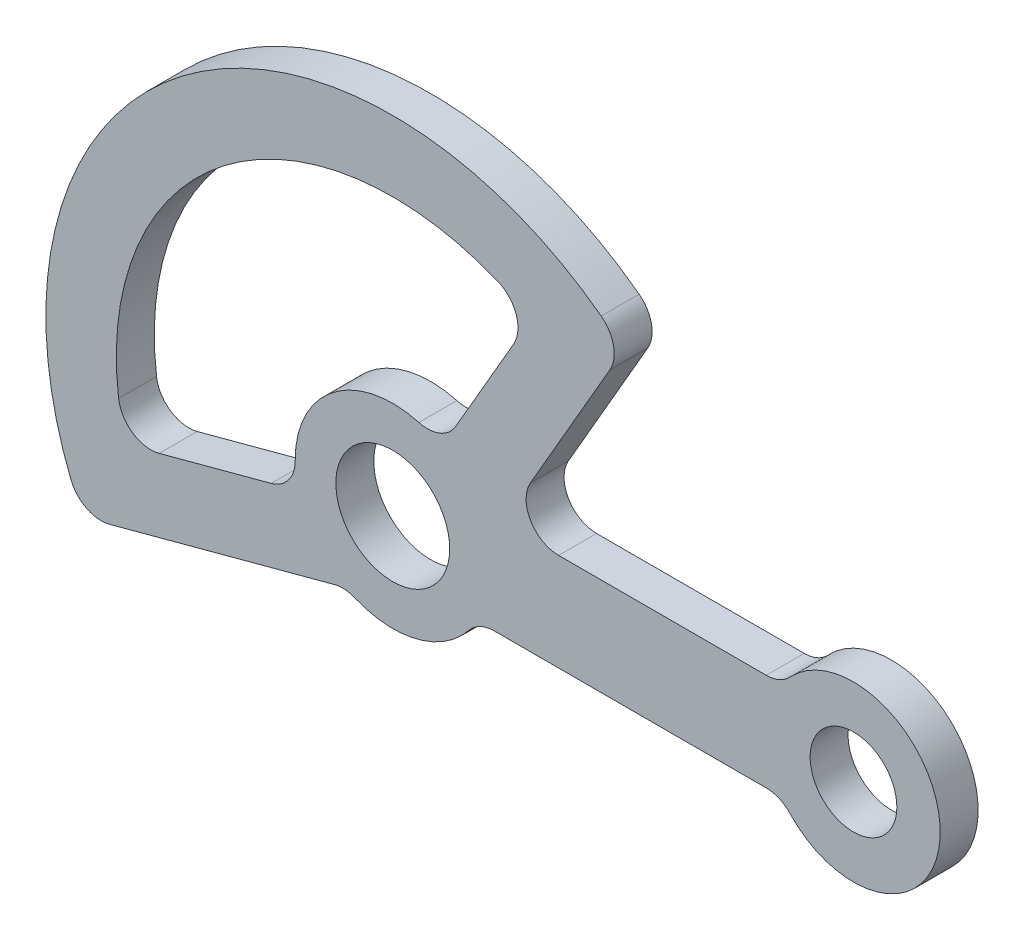
ISO-10303-21;
HEADER;
FILE_DESCRIPTION(('STEP AP214'),'2;1');
FILE_NAME('part.step','',(''),(''),'','','');
FILE_SCHEMA(('AUTOMOTIVE_DESIGN { 1 0 10303 214 1 1 1 1 }'));
ENDSEC;
DATA;
#1=APPLICATION_CONTEXT('core data for automotive mechanical design processes');
#2=APPLICATION_PROTOCOL_DEFINITION('international standard','automotive_design',2000,#1);
#3=PRODUCT_CONTEXT('',#1,'mechanical');
#4=PRODUCT('Part','Part','',(#3));
#5=PRODUCT_RELATED_PRODUCT_CATEGORY('part','',(#4));
#6=PRODUCT_DEFINITION_FORMATION('','',#4);
#7=PRODUCT_DEFINITION_CONTEXT('part definition',#1,'design');
#8=PRODUCT_DEFINITION('design','',#6,#7);
#9=PRODUCT_DEFINITION_SHAPE('','',#8);
#10=(LENGTH_UNIT() NAMED_UNIT(*) SI_UNIT(.MILLI.,.METRE.));
#11=(NAMED_UNIT(*) PLANE_ANGLE_UNIT() SI_UNIT($,.RADIAN.));
#12=(NAMED_UNIT(*) SI_UNIT($,.STERADIAN.) SOLID_ANGLE_UNIT());
#13=UNCERTAINTY_MEASURE_WITH_UNIT(LENGTH_MEASURE(1.E-05),#10,'distance_accuracy_value','');
#14=(GEOMETRIC_REPRESENTATION_CONTEXT(3) GLOBAL_UNCERTAINTY_ASSIGNED_CONTEXT((#13)) GLOBAL_UNIT_ASSIGNED_CONTEXT((#10,
#11,#12)) REPRESENTATION_CONTEXT('',''));
#15=CARTESIAN_POINT('',(0.,0.,0.));
#16=DIRECTION('',(0.,0.,1.));
#17=DIRECTION('',(1.,0.,0.));
#18=AXIS2_PLACEMENT_3D('',#15,#16,#17);
#19=CARTESIAN_POINT('',(0.,0.,7.));
#20=DIRECTION('',(-0.866025403784442,0.499999999999994,0.));
#21=DIRECTION('',(-0.499999999999995,-0.866025403784442,0.));
#22=AXIS2_PLACEMENT_3D('',#19,#20,#21);
#23=PLANE('',#22);
#24=DIRECTION('',(0.499999999999995,0.866025403784442,0.));
#25=VECTOR('',#24,1.);
#26=CARTESIAN_POINT('',(0.,0.,0.));
#27=LINE('',#26,#25);
#28=CARTESIAN_POINT('',(11.6189500386221,20.1246117974982,0.));
#29=VERTEX_POINT('',#28);
#30=CARTESIAN_POINT('',(22.2991031209775,38.6231795687513,0.));
#31=VERTEX_POINT('',#30);
#32=EDGE_CURVE('E275',#29,#31,#27,.T.);
#33=ORIENTED_EDGE('',*,*,#32,.F.);
#34=DIRECTION('',(0.,0.,-1.));
#35=VECTOR('',#34,1.);
#36=CARTESIAN_POINT('',(11.6189500386221,20.1246117974982,7.));
#37=LINE('',#36,#35);
#38=CARTESIAN_POINT('',(11.6189500386221,20.1246117974982,7.));
#39=VERTEX_POINT('',#38);
#40=EDGE_CURVE('E11',#39,#29,#37,.T.);
#41=ORIENTED_EDGE('',*,*,#40,.F.);
#42=DIRECTION('',(0.499999999999995,0.866025403784442,0.));
#43=VECTOR('',#42,1.);
#44=CARTESIAN_POINT('',(0.,0.,7.));
#45=LINE('',#44,#43);
#46=CARTESIAN_POINT('',(22.2991031209775,38.6231795687513,7.));
#47=VERTEX_POINT('',#46);
#48=EDGE_CURVE('E639',#39,#47,#45,.T.);
#49=ORIENTED_EDGE('',*,*,#48,.T.);
#50=DIRECTION('',(0.,0.,-1.));
#51=VECTOR('',#50,1.);
#52=CARTESIAN_POINT('',(22.2991031209775,38.6231795687513,7.));
#53=LINE('',#52,#51);
#54=EDGE_CURVE('E59',#47,#31,#53,.T.);
#55=ORIENTED_EDGE('',*,*,#54,.T.);
#56=EDGE_LOOP('',(#33,#41,#49,#55));
#57=FACE_BOUND('',#56,.T.);
#58=ADVANCED_FACE('F39',(#57),#23,.T.);
#59=CARTESIAN_POINT('',(6.42279761591547,23.1246117974981,7.));
#60=DIRECTION('',(0.,0.,-1.));
#61=DIRECTION('',(-1.,0.,0.));
#62=AXIS2_PLACEMENT_3D('',#59,#60,#61);
#63=CYLINDRICAL_SURFACE('',#62,6.);
#64=CARTESIAN_POINT('',(6.42279761591547,23.1246117974981,0.));
#65=DIRECTION('',(0.,0.,1.));
#66=DIRECTION('',(1.,0.,0.));
#67=AXIS2_PLACEMENT_3D('',#64,#65,#66);
#68=CIRCLE('',#67,6.);
#69=CARTESIAN_POINT('',(4.81709821193661,17.3434588481236,0.));
#70=VERTEX_POINT('',#69);
#71=EDGE_CURVE('E272',#29,#70,#68,.F.);
#72=ORIENTED_EDGE('',*,*,#71,.T.);
#73=DIRECTION('',(0.,0.,-1.));
#74=VECTOR('',#73,1.);
#75=CARTESIAN_POINT('',(4.81709821193661,17.3434588481236,7.));
#76=LINE('',#75,#74);
#77=CARTESIAN_POINT('',(4.81709821193661,17.3434588481236,7.));
#78=VERTEX_POINT('',#77);
#79=EDGE_CURVE('E47',#78,#70,#76,.T.);
#80=ORIENTED_EDGE('',*,*,#79,.F.);
#81=CARTESIAN_POINT('',(6.42279761591547,23.1246117974981,7.));
#82=DIRECTION('',(0.,0.,1.));
#83=DIRECTION('',(1.,0.,0.));
#84=AXIS2_PLACEMENT_3D('',#81,#82,#83);
#85=CIRCLE('',#84,6.);
#86=EDGE_CURVE('E634',#39,#78,#85,.F.);
#87=ORIENTED_EDGE('',*,*,#86,.F.);
#88=ORIENTED_EDGE('',*,*,#40,.T.);
#89=EDGE_LOOP('',(#72,#80,#87,#88));
#90=FACE_BOUND('',#89,.T.);
#91=ADVANCED_FACE('F414',(#90),#63,.F.);
#92=CARTESIAN_POINT('',(0.,0.,7.));
#93=DIRECTION('',(0.,0.,-1.));
#94=DIRECTION('',(-1.,0.,0.));
#95=AXIS2_PLACEMENT_3D('',#92,#93,#94);
#96=CYLINDRICAL_SURFACE('',#95,18.);
#97=CARTESIAN_POINT('',(0.,0.,0.));
#98=DIRECTION('',(0.,0.,1.));
#99=DIRECTION('',(1.,0.,0.));
#100=AXIS2_PLACEMENT_3D('',#97,#98,#99);
#101=CIRCLE('',#100,18.);
#102=CARTESIAN_POINT('',(-17.9992515779627,-0.164142112834368,0.));
#103=VERTEX_POINT('',#102);
#104=EDGE_CURVE('E280',#70,#103,#101,.T.);
#105=ORIENTED_EDGE('',*,*,#104,.T.);
#106=DIRECTION('',(0.,0.,-1.));
#107=VECTOR('',#106,1.);
#108=CARTESIAN_POINT('',(-17.9992515779627,-0.164142112834368,7.));
#109=LINE('',#108,#107);
#110=CARTESIAN_POINT('',(-17.9992515779627,-0.164142112834368,7.));
#111=VERTEX_POINT('',#110);
#112=EDGE_CURVE('E299',#111,#103,#109,.T.);
#113=ORIENTED_EDGE('',*,*,#112,.F.);
#114=CARTESIAN_POINT('',(0.,0.,7.));
#115=DIRECTION('',(0.,0.,1.));
#116=DIRECTION('',(1.,0.,0.));
#117=AXIS2_PLACEMENT_3D('',#114,#115,#116);
#118=CIRCLE('',#117,18.);
#119=EDGE_CURVE('E633',#78,#111,#118,.T.);
#120=ORIENTED_EDGE('',*,*,#119,.F.);
#121=ORIENTED_EDGE('',*,*,#79,.T.);
#122=EDGE_LOOP('',(#105,#113,#120,#121));
#123=FACE_BOUND('',#122,.T.);
#124=ADVANCED_FACE('F418',(#123),#96,.T.);
#125=CARTESIAN_POINT('',(-23.9990021039503,-0.218856150445829,7.));
#126=DIRECTION('',(0.,0.,-1.));
#127=DIRECTION('',(-1.,0.,0.));
#128=AXIS2_PLACEMENT_3D('',#125,#126,#127);
#129=CYLINDRICAL_SURFACE('',#128,6.);
#130=CARTESIAN_POINT('',(-23.9990021039503,-0.218856150445829,0.));
#131=DIRECTION('',(0.,0.,1.));
#132=DIRECTION('',(1.,0.,0.));
#133=AXIS2_PLACEMENT_3D('',#130,#131,#132);
#134=CIRCLE('',#133,6.);
#135=CARTESIAN_POINT('',(-22.4460878333352,-6.01441110818024,0.));
#136=VERTEX_POINT('',#135);
#137=EDGE_CURVE('E279',#136,#103,#134,.T.);
#138=ORIENTED_EDGE('',*,*,#137,.F.);
#139=DIRECTION('',(0.,0.,-1.));
#140=VECTOR('',#139,1.);
#141=CARTESIAN_POINT('',(-22.4460878333352,-6.01441110818024,7.));
#142=LINE('',#141,#140);
#143=CARTESIAN_POINT('',(-22.4460878333352,-6.01441110818024,7.));
#144=VERTEX_POINT('',#143);
#145=EDGE_CURVE('E296',#144,#136,#142,.T.);
#146=ORIENTED_EDGE('',*,*,#145,.F.);
#147=CARTESIAN_POINT('',(-23.9990021039503,-0.218856150445829,7.));
#148=DIRECTION('',(0.,0.,1.));
#149=DIRECTION('',(1.,0.,0.));
#150=AXIS2_PLACEMENT_3D('',#147,#148,#149);
#151=CIRCLE('',#150,6.);
#152=EDGE_CURVE('E635',#144,#111,#151,.T.);
#153=ORIENTED_EDGE('',*,*,#152,.T.);
#154=ORIENTED_EDGE('',*,*,#112,.T.);
#155=EDGE_LOOP('',(#138,#146,#153,#154));
#156=FACE_BOUND('',#155,.T.);
#157=ADVANCED_FACE('F589',(#156),#129,.F.);
#158=CARTESIAN_POINT('',(0.,0.,7.));
#159=DIRECTION('',(0.258819045102522,-0.965925826289068,0.));
#160=DIRECTION('',(0.965925826289068,0.258819045102522,0.));
#161=AXIS2_PLACEMENT_3D('',#158,#159,#160);
#162=PLANE('',#161);
#163=DIRECTION('',(-0.965925826289068,-0.258819045102522,0.));
#164=VECTOR('',#163,1.);
#165=CARTESIAN_POINT('',(0.,0.,0.));
#166=LINE('',#165,#164);
#167=CARTESIAN_POINT('',(-43.0785592152711,-11.5428651528282,0.));
#168=VERTEX_POINT('',#167);
#169=EDGE_CURVE('E284',#136,#168,#166,.T.);
#170=ORIENTED_EDGE('',*,*,#169,.T.);
#171=DIRECTION('',(0.,0.,-1.));
#172=VECTOR('',#171,1.);
#173=CARTESIAN_POINT('',(-43.0785592152711,-11.5428651528282,7.));
#174=LINE('',#173,#172);
#175=CARTESIAN_POINT('',(-43.0785592152711,-11.5428651528282,7.));
#176=VERTEX_POINT('',#175);
#177=EDGE_CURVE('E214',#176,#168,#174,.T.);
#178=ORIENTED_EDGE('',*,*,#177,.F.);
#179=DIRECTION('',(-0.965925826289068,-0.258819045102522,0.));
#180=VECTOR('',#179,1.);
#181=CARTESIAN_POINT('',(0.,0.,7.));
#182=LINE('',#181,#180);
#183=EDGE_CURVE('E204',#144,#176,#182,.T.);
#184=ORIENTED_EDGE('',*,*,#183,.F.);
#185=ORIENTED_EDGE('',*,*,#145,.T.);
#186=EDGE_LOOP('',(#170,#178,#184,#185));
#187=FACE_BOUND('',#186,.T.);
#188=ADVANCED_FACE('F585',(#187),#162,.F.);
#189=CARTESIAN_POINT('',(-44.6314734858863,-5.74731019509384,7.));
#190=DIRECTION('',(0.,0.,-1.));
#191=DIRECTION('',(-1.,0.,0.));
#192=AXIS2_PLACEMENT_3D('',#189,#190,#191);
#193=CYLINDRICAL_SURFACE('',#192,6.);
#194=CARTESIAN_POINT('',(-44.6314734858863,-5.74731019509384,0.));
#195=DIRECTION('',(0.,0.,1.));
#196=DIRECTION('',(1.,0.,0.));
#197=AXIS2_PLACEMENT_3D('',#194,#195,#196);
#198=CIRCLE('',#197,6.);
#199=CARTESIAN_POINT('',(-50.5823366173378,-6.51361822110634,0.));
#200=VERTEX_POINT('',#199);
#201=EDGE_CURVE('E212',#168,#200,#198,.F.);
#202=ORIENTED_EDGE('',*,*,#201,.T.);
#203=DIRECTION('',(0.,0.,-1.));
#204=VECTOR('',#203,1.);
#205=CARTESIAN_POINT('',(-50.5823366173378,-6.51361822110634,7.));
#206=LINE('',#205,#204);
#207=CARTESIAN_POINT('',(-50.5823366173378,-6.51361822110634,7.));
#208=VERTEX_POINT('',#207);
#209=EDGE_CURVE('E210',#208,#200,#206,.T.);
#210=ORIENTED_EDGE('',*,*,#209,.F.);
#211=CARTESIAN_POINT('',(-44.6314734858863,-5.74731019509384,7.));
#212=DIRECTION('',(0.,0.,1.));
#213=DIRECTION('',(1.,0.,0.));
#214=AXIS2_PLACEMENT_3D('',#211,#212,#213);
#215=CIRCLE('',#214,6.);
#216=EDGE_CURVE('E193',#176,#208,#215,.F.);
#217=ORIENTED_EDGE('',*,*,#216,.F.);
#218=ORIENTED_EDGE('',*,*,#177,.T.);
#219=EDGE_LOOP('',(#202,#210,#217,#218));
#220=FACE_BOUND('',#219,.T.);
#221=ADVANCED_FACE('F213',(#220),#193,.F.);
#222=CARTESIAN_POINT('',(0.,0.,7.));
#223=DIRECTION('',(0.,0.,-1.));
#224=DIRECTION('',(-1.,0.,0.));
#225=AXIS2_PLACEMENT_3D('',#222,#223,#224);
#226=CYLINDRICAL_SURFACE('',#225,51.);
#227=CARTESIAN_POINT('',(0.,0.,0.));
#228=DIRECTION('',(0.,0.,1.));
#229=DIRECTION('',(1.,0.,0.));
#230=AXIS2_PLACEMENT_3D('',#227,#228,#229);
#231=CIRCLE('',#230,51.);
#232=CARTESIAN_POINT('',(19.383344124707,47.1729368445848,0.));
#233=VERTEX_POINT('',#232);
#234=EDGE_CURVE('E287',#233,#200,#231,.T.);
#235=ORIENTED_EDGE('',*,*,#234,.F.);
#236=DIRECTION('',(0.,0.,-1.));
#237=VECTOR('',#236,1.);
#238=CARTESIAN_POINT('',(19.383344124707,47.1729368445848,7.));
#239=LINE('',#238,#237);
#240=CARTESIAN_POINT('',(19.383344124707,47.1729368445848,7.));
#241=VERTEX_POINT('',#240);
#242=EDGE_CURVE('E124',#241,#233,#239,.T.);
#243=ORIENTED_EDGE('',*,*,#242,.F.);
#244=CARTESIAN_POINT('',(0.,0.,7.));
#245=DIRECTION('',(0.,0.,1.));
#246=DIRECTION('',(1.,0.,0.));
#247=AXIS2_PLACEMENT_3D('',#244,#245,#246);
#248=CIRCLE('',#247,51.);
#249=EDGE_CURVE('E202',#241,#208,#248,.T.);
#250=ORIENTED_EDGE('',*,*,#249,.T.);
#251=ORIENTED_EDGE('',*,*,#209,.T.);
#252=EDGE_LOOP('',(#235,#243,#250,#251));
#253=FACE_BOUND('',#252,.T.);
#254=ADVANCED_FACE('F220',(#253),#226,.F.);
#255=CARTESIAN_POINT('',(11.2583302491978,-6.49999999999993,7.));
#256=DIRECTION('',(0.866025403784442,-0.499999999999994,0.));
#257=DIRECTION('',(0.499999999999995,0.866025403784442,0.));
#258=AXIS2_PLACEMENT_3D('',#255,#256,#257);
#259=PLANE('',#258);
#260=DIRECTION('',(-0.499999999999995,-0.866025403784442,0.));
#261=VECTOR('',#260,1.);
#262=CARTESIAN_POINT('',(11.2583302491978,-6.49999999999993,0.));
#263=LINE('',#262,#261);
#264=CARTESIAN_POINT('',(40.046348590167,43.3623104157842,0.));
#265=VERTEX_POINT('',#264);
#266=CARTESIAN_POINT('',(25.4034118443433,18.,0.));
#267=VERTEX_POINT('',#266);
#268=EDGE_CURVE('E229',#265,#267,#263,.T.);
#269=ORIENTED_EDGE('',*,*,#268,.F.);
#270=DIRECTION('',(0.,0.,-1.));
#271=VECTOR('',#270,1.);
#272=CARTESIAN_POINT('',(40.046348590167,43.3623104157842,7.));
#273=LINE('',#272,#271);
#274=CARTESIAN_POINT('',(40.046348590167,43.3623104157842,7.));
#275=VERTEX_POINT('',#274);
#276=EDGE_CURVE('E43',#275,#265,#273,.T.);
#277=ORIENTED_EDGE('',*,*,#276,.F.);
#278=DIRECTION('',(-0.499999999999995,-0.866025403784442,0.));
#279=VECTOR('',#278,1.);
#280=CARTESIAN_POINT('',(11.2583302491978,-6.49999999999993,7.));
#281=LINE('',#280,#279);
#282=CARTESIAN_POINT('',(25.4034118443433,18.,7.));
#283=VERTEX_POINT('',#282);
#284=EDGE_CURVE('E342',#275,#283,#281,.T.);
#285=ORIENTED_EDGE('',*,*,#284,.T.);
#286=DIRECTION('',(0.,0.,-1.));
#287=VECTOR('',#286,1.);
#288=CARTESIAN_POINT('',(25.4034118443433,18.,7.));
#289=LINE('',#288,#287);
#290=EDGE_CURVE('E217',#283,#267,#289,.T.);
#291=ORIENTED_EDGE('',*,*,#290,.T.);
#292=EDGE_LOOP('',(#269,#277,#285,#291));
#293=FACE_BOUND('',#292,.T.);
#294=ADVANCED_FACE('F341',(#293),#259,.T.);
#295=CARTESIAN_POINT('',(34.8501961674603,46.3623104157842,7.));
#296=DIRECTION('',(0.,0.,-1.));
#297=DIRECTION('',(-1.,0.,0.));
#298=AXIS2_PLACEMENT_3D('',#295,#296,#297);
#299=CYLINDRICAL_SURFACE('',#298,6.00000000000001);
#300=CARTESIAN_POINT('',(34.8501961674603,46.3623104157842,0.));
#301=DIRECTION('',(0.,0.,1.));
#302=DIRECTION('',(1.,0.,0.));
#303=AXIS2_PLACEMENT_3D('',#300,#301,#302);
#304=CIRCLE('',#303,6.00000000000001);
#305=CARTESIAN_POINT('',(38.455388874439,51.1584114932791,0.));
#306=VERTEX_POINT('',#305);
#307=EDGE_CURVE('E232',#265,#306,#304,.T.);
#308=ORIENTED_EDGE('',*,*,#307,.T.);
#309=DIRECTION('',(0.,0.,-1.));
#310=VECTOR('',#309,1.);
#311=CARTESIAN_POINT('',(38.455388874439,51.1584114932791,7.));
#312=LINE('',#311,#310);
#313=CARTESIAN_POINT('',(38.455388874439,51.1584114932791,7.));
#314=VERTEX_POINT('',#313);
#315=EDGE_CURVE('E330',#314,#306,#312,.T.);
#316=ORIENTED_EDGE('',*,*,#315,.F.);
#317=CARTESIAN_POINT('',(34.8501961674603,46.3623104157842,7.));
#318=DIRECTION('',(0.,0.,1.));
#319=DIRECTION('',(1.,0.,0.));
#320=AXIS2_PLACEMENT_3D('',#317,#318,#319);
#321=CIRCLE('',#320,6.00000000000001);
#322=EDGE_CURVE('E335',#275,#314,#321,.T.);
#323=ORIENTED_EDGE('',*,*,#322,.F.);
#324=ORIENTED_EDGE('',*,*,#276,.T.);
#325=EDGE_LOOP('',(#308,#316,#323,#324));
#326=FACE_BOUND('',#325,.T.);
#327=ADVANCED_FACE('F334',(#326),#299,.T.);
#328=CARTESIAN_POINT('',(0.,0.,7.));
#329=DIRECTION('',(0.,0.,-1.));
#330=DIRECTION('',(-1.,0.,0.));
#331=AXIS2_PLACEMENT_3D('',#328,#329,#330);
#332=CYLINDRICAL_SURFACE('',#331,64.);
#333=CARTESIAN_POINT('',(0.,0.,0.));
#334=DIRECTION('',(0.,0.,1.));
#335=DIRECTION('',(1.,0.,0.));
#336=AXIS2_PLACEMENT_3D('',#333,#334,#335);
#337=CIRCLE('',#336,64.);
#338=CARTESIAN_POINT('',(-59.36821792081,-23.904282062158,0.));
#339=VERTEX_POINT('',#338);
#340=EDGE_CURVE('E237',#306,#339,#337,.T.);
#341=ORIENTED_EDGE('',*,*,#340,.T.);
#342=DIRECTION('',(0.,0.,-1.));
#343=VECTOR('',#342,1.);
#344=CARTESIAN_POINT('',(-59.36821792081,-23.904282062158,7.));
#345=LINE('',#344,#343);
#346=CARTESIAN_POINT('',(-59.36821792081,-23.904282062158,7.));
#347=VERTEX_POINT('',#346);
#348=EDGE_CURVE('E327',#347,#339,#345,.T.);
#349=ORIENTED_EDGE('',*,*,#348,.F.);
#350=CARTESIAN_POINT('',(0.,0.,7.));
#351=DIRECTION('',(0.,0.,1.));
#352=DIRECTION('',(1.,0.,0.));
#353=AXIS2_PLACEMENT_3D('',#350,#351,#352);
#354=CIRCLE('',#353,64.);
#355=EDGE_CURVE('E654',#314,#347,#354,.T.);
#356=ORIENTED_EDGE('',*,*,#355,.F.);
#357=ORIENTED_EDGE('',*,*,#315,.T.);
#358=EDGE_LOOP('',(#341,#349,#356,#357));
#359=FACE_BOUND('',#358,.T.);
#360=ADVANCED_FACE('F404',(#359),#332,.T.);
#361=CARTESIAN_POINT('',(-53.8024474907341,-21.6632556188307,7.));
#362=DIRECTION('',(0.,0.,-1.));
#363=DIRECTION('',(-1.,0.,0.));
#364=AXIS2_PLACEMENT_3D('',#361,#362,#363);
#365=CYLINDRICAL_SURFACE('',#364,6.);
#366=CARTESIAN_POINT('',(-53.8024474907341,-21.6632556188307,0.));
#367=DIRECTION('',(0.,0.,1.));
#368=DIRECTION('',(1.,0.,0.));
#369=AXIS2_PLACEMENT_3D('',#366,#367,#368);
#370=CIRCLE('',#369,6.);
#371=CARTESIAN_POINT('',(-52.2495332201189,-27.4588105765651,0.));
#372=VERTEX_POINT('',#371);
#373=EDGE_CURVE('E236',#372,#339,#370,.F.);
#374=ORIENTED_EDGE('',*,*,#373,.F.);
#375=DIRECTION('',(0.,0.,-1.));
#376=VECTOR('',#375,1.);
#377=CARTESIAN_POINT('',(-52.2495332201189,-27.4588105765651,7.));
#378=LINE('',#377,#376);
#379=CARTESIAN_POINT('',(-52.2495332201189,-27.4588105765651,7.));
#380=VERTEX_POINT('',#379);
#381=EDGE_CURVE('E323',#380,#372,#378,.T.);
#382=ORIENTED_EDGE('',*,*,#381,.F.);
#383=CARTESIAN_POINT('',(-53.8024474907341,-21.6632556188307,7.));
#384=DIRECTION('',(0.,0.,1.));
#385=DIRECTION('',(1.,0.,0.));
#386=AXIS2_PLACEMENT_3D('',#383,#384,#385);
#387=CIRCLE('',#386,6.);
#388=EDGE_CURVE('E402',#380,#347,#387,.F.);
#389=ORIENTED_EDGE('',*,*,#388,.T.);
#390=ORIENTED_EDGE('',*,*,#348,.T.);
#391=EDGE_LOOP('',(#374,#382,#389,#390));
#392=FACE_BOUND('',#391,.T.);
#393=ADVANCED_FACE('F397',(#392),#365,.T.);
#394=CARTESIAN_POINT('',(3.36464758633278,-12.5570357417579,7.));
#395=DIRECTION('',(0.258819045102522,-0.965925826289068,0.));
#396=DIRECTION('',(0.965925826289068,0.258819045102522,0.));
#397=AXIS2_PLACEMENT_3D('',#394,#395,#396);
#398=PLANE('',#397);
#399=DIRECTION('',(-0.965925826289068,-0.258819045102522,0.));
#400=VECTOR('',#399,1.);
#401=CARTESIAN_POINT('',(3.36464758633278,-12.5570357417579,0.));
#402=LINE('',#401,#400);
#403=CARTESIAN_POINT('',(-10.7986052500331,-16.35206790146,0.));
#404=VERTEX_POINT('',#403);
#405=EDGE_CURVE('E242',#404,#372,#402,.T.);
#406=ORIENTED_EDGE('',*,*,#405,.F.);
#407=DIRECTION('',(0.,0.,-1.));
#408=VECTOR('',#407,1.);
#409=CARTESIAN_POINT('',(-10.7986052500331,-16.35206790146,7.));
#410=LINE('',#409,#408);
#411=CARTESIAN_POINT('',(-10.7986052500331,-16.35206790146,7.));
#412=VERTEX_POINT('',#411);
#413=EDGE_CURVE('E325',#412,#404,#410,.T.);
#414=ORIENTED_EDGE('',*,*,#413,.F.);
#415=DIRECTION('',(-0.965925826289068,-0.258819045102522,0.));
#416=VECTOR('',#415,1.);
#417=CARTESIAN_POINT('',(3.36464758633278,-12.5570357417579,7.));
#418=LINE('',#417,#416);
#419=EDGE_CURVE('E400',#412,#380,#418,.T.);
#420=ORIENTED_EDGE('',*,*,#419,.T.);
#421=ORIENTED_EDGE('',*,*,#381,.T.);
#422=EDGE_LOOP('',(#406,#414,#420,#421));
#423=FACE_BOUND('',#422,.T.);
#424=ADVANCED_FACE('F398',(#423),#398,.T.);
#425=CARTESIAN_POINT('',(-9.24569097941799,-22.1476228591944,7.));
#426=DIRECTION('',(0.,0.,-1.));
#427=DIRECTION('',(-1.,0.,0.));
#428=AXIS2_PLACEMENT_3D('',#425,#426,#427);
#429=CYLINDRICAL_SURFACE('',#428,6.);
#430=CARTESIAN_POINT('',(-9.24569097941799,-22.1476228591944,0.));
#431=DIRECTION('',(0.,0.,1.));
#432=DIRECTION('',(1.,0.,0.));
#433=AXIS2_PLACEMENT_3D('',#430,#431,#432);
#434=CIRCLE('',#433,6.);
#435=CARTESIAN_POINT('',(-6.9342682345635,-16.6107171443958,0.));
#436=VERTEX_POINT('',#435);
#437=EDGE_CURVE('E245',#404,#436,#434,.F.);
#438=ORIENTED_EDGE('',*,*,#437,.T.);
#439=DIRECTION('',(0.,0.,-1.));
#440=VECTOR('',#439,1.);
#441=CARTESIAN_POINT('',(-6.9342682345635,-16.6107171443958,7.));
#442=LINE('',#441,#440);
#443=CARTESIAN_POINT('',(-6.9342682345635,-16.6107171443958,7.));
#444=VERTEX_POINT('',#443);
#445=EDGE_CURVE('E317',#444,#436,#442,.T.);
#446=ORIENTED_EDGE('',*,*,#445,.F.);
#447=CARTESIAN_POINT('',(-9.24569097941799,-22.1476228591944,7.));
#448=DIRECTION('',(0.,0.,1.));
#449=DIRECTION('',(1.,0.,0.));
#450=AXIS2_PLACEMENT_3D('',#447,#448,#449);
#451=CIRCLE('',#450,6.);
#452=EDGE_CURVE('E392',#412,#444,#451,.F.);
#453=ORIENTED_EDGE('',*,*,#452,.F.);
#454=ORIENTED_EDGE('',*,*,#413,.T.);
#455=EDGE_LOOP('',(#438,#446,#453,#454));
#456=FACE_BOUND('',#455,.T.);
#457=ADVANCED_FACE('F393',(#456),#429,.F.);
#458=CARTESIAN_POINT('',(0.,0.,7.));
#459=DIRECTION('',(0.,0.,-1.));
#460=DIRECTION('',(-1.,0.,0.));
#461=AXIS2_PLACEMENT_3D('',#458,#459,#460);
#462=CYLINDRICAL_SURFACE('',#461,18.);
#463=CARTESIAN_POINT('',(0.,0.,0.));
#464=DIRECTION('',(0.,0.,1.));
#465=DIRECTION('',(1.,0.,0.));
#466=AXIS2_PLACEMENT_3D('',#463,#464,#465);
#467=CIRCLE('',#466,18.);
#468=CARTESIAN_POINT('',(14.0512454963964,-11.25,0.));
#469=VERTEX_POINT('',#468);
#470=EDGE_CURVE('E246',#436,#469,#467,.T.);
#471=ORIENTED_EDGE('',*,*,#470,.T.);
#472=DIRECTION('',(0.,0.,-1.));
#473=VECTOR('',#472,1.);
#474=CARTESIAN_POINT('',(14.0512454963964,-11.25,7.));
#475=LINE('',#474,#473);
#476=CARTESIAN_POINT('',(14.0512454963964,-11.25,7.));
#477=VERTEX_POINT('',#476);
#478=EDGE_CURVE('E320',#477,#469,#475,.T.);
#479=ORIENTED_EDGE('',*,*,#478,.F.);
#480=CARTESIAN_POINT('',(0.,0.,7.));
#481=DIRECTION('',(0.,0.,1.));
#482=DIRECTION('',(1.,0.,0.));
#483=AXIS2_PLACEMENT_3D('',#480,#481,#482);
#484=CIRCLE('',#483,18.);
#485=EDGE_CURVE('E387',#444,#477,#484,.T.);
#486=ORIENTED_EDGE('',*,*,#485,.F.);
#487=ORIENTED_EDGE('',*,*,#445,.T.);
#488=EDGE_LOOP('',(#471,#479,#486,#487));
#489=FACE_BOUND('',#488,.T.);
#490=ADVANCED_FACE('F386',(#489),#462,.T.);
#491=CARTESIAN_POINT('',(18.7349939951952,-15.,7.));
#492=DIRECTION('',(0.,0.,-1.));
#493=DIRECTION('',(-1.,0.,0.));
#494=AXIS2_PLACEMENT_3D('',#491,#492,#493);
#495=CYLINDRICAL_SURFACE('',#494,6.);
#496=CARTESIAN_POINT('',(18.7349939951952,-15.,0.));
#497=DIRECTION('',(0.,0.,1.));
#498=DIRECTION('',(1.,0.,0.));
#499=AXIS2_PLACEMENT_3D('',#496,#497,#498);
#500=CIRCLE('',#499,6.);
#501=CARTESIAN_POINT('',(18.7349939951952,-9.,0.));
#502=VERTEX_POINT('',#501);
#503=EDGE_CURVE('E251',#502,#469,#500,.T.);
#504=ORIENTED_EDGE('',*,*,#503,.F.);
#505=DIRECTION('',(0.,0.,-1.));
#506=VECTOR('',#505,1.);
#507=CARTESIAN_POINT('',(18.7349939951952,-9.,7.));
#508=LINE('',#507,#506);
#509=CARTESIAN_POINT('',(18.7349939951952,-9.,7.));
#510=VERTEX_POINT('',#509);
#511=EDGE_CURVE('E314',#510,#502,#508,.T.);
#512=ORIENTED_EDGE('',*,*,#511,.F.);
#513=CARTESIAN_POINT('',(18.7349939951952,-15.,7.));
#514=DIRECTION('',(0.,0.,1.));
#515=DIRECTION('',(1.,0.,0.));
#516=AXIS2_PLACEMENT_3D('',#513,#514,#515);
#517=CIRCLE('',#516,6.);
#518=EDGE_CURVE('E380',#510,#477,#517,.T.);
#519=ORIENTED_EDGE('',*,*,#518,.T.);
#520=ORIENTED_EDGE('',*,*,#478,.T.);
#521=EDGE_LOOP('',(#504,#512,#519,#520));
#522=FACE_BOUND('',#521,.T.);
#523=ADVANCED_FACE('F378',(#522),#495,.F.);
#524=CARTESIAN_POINT('',(0.,-9.,7.));
#525=DIRECTION('',(0.,1.,0.));
#526=DIRECTION('',(-1.,0.,0.));
#527=AXIS2_PLACEMENT_3D('',#524,#525,#526);
#528=PLANE('',#527);
#529=DIRECTION('',(1.,0.,0.));
#530=VECTOR('',#529,1.);
#531=CARTESIAN_POINT('',(0.,-9.,0.));
#532=LINE('',#531,#530);
#533=CARTESIAN_POINT('',(68.9065230605689,-9.,0.));
#534=VERTEX_POINT('',#533);
#535=EDGE_CURVE('E253',#502,#534,#532,.T.);
#536=ORIENTED_EDGE('',*,*,#535,.T.);
#537=DIRECTION('',(0.,0.,-1.));
#538=VECTOR('',#537,1.);
#539=CARTESIAN_POINT('',(68.9065230605689,-9.,7.));
#540=LINE('',#539,#538);
#541=CARTESIAN_POINT('',(68.9065230605689,-9.,7.));
#542=VERTEX_POINT('',#541);
#543=EDGE_CURVE('E315',#542,#534,#540,.T.);
#544=ORIENTED_EDGE('',*,*,#543,.F.);
#545=DIRECTION('',(1.,0.,0.));
#546=VECTOR('',#545,1.);
#547=CARTESIAN_POINT('',(0.,-9.,7.));
#548=LINE('',#547,#546);
#549=EDGE_CURVE('E373',#510,#542,#548,.T.);
#550=ORIENTED_EDGE('',*,*,#549,.F.);
#551=ORIENTED_EDGE('',*,*,#511,.T.);
#552=EDGE_LOOP('',(#536,#544,#550,#551));
#553=FACE_BOUND('',#552,.T.);
#554=ADVANCED_FACE('F371',(#553),#528,.F.);
#555=CARTESIAN_POINT('',(68.9065230605689,-15.,7.));
#556=DIRECTION('',(0.,0.,-1.));
#557=DIRECTION('',(-1.,0.,0.));
#558=AXIS2_PLACEMENT_3D('',#555,#556,#557);
#559=CYLINDRICAL_SURFACE('',#558,6.);
#560=CARTESIAN_POINT('',(68.9065230605689,-15.,0.));
#561=DIRECTION('',(0.,0.,1.));
#562=DIRECTION('',(1.,0.,0.));
#563=AXIS2_PLACEMENT_3D('',#560,#561,#562);
#564=CIRCLE('',#563,6.);
#565=CARTESIAN_POINT('',(73.2956531349592,-10.9090909090909,0.));
#566=VERTEX_POINT('',#565);
#567=EDGE_CURVE('E257',#534,#566,#564,.F.);
#568=ORIENTED_EDGE('',*,*,#567,.T.);
#569=DIRECTION('',(0.,0.,-1.));
#570=VECTOR('',#569,1.);
#571=CARTESIAN_POINT('',(73.2956531349592,-10.9090909090909,7.));
#572=LINE('',#571,#570);
#573=CARTESIAN_POINT('',(73.2956531349592,-10.9090909090909,7.));
#574=VERTEX_POINT('',#573);
#575=EDGE_CURVE('E309',#574,#566,#572,.T.);
#576=ORIENTED_EDGE('',*,*,#575,.F.);
#577=CARTESIAN_POINT('',(68.9065230605689,-15.,7.));
#578=DIRECTION('',(0.,0.,1.));
#579=DIRECTION('',(1.,0.,0.));
#580=AXIS2_PLACEMENT_3D('',#577,#578,#579);
#581=CIRCLE('',#580,6.);
#582=EDGE_CURVE('E369',#542,#574,#581,.F.);
#583=ORIENTED_EDGE('',*,*,#582,.F.);
#584=ORIENTED_EDGE('',*,*,#543,.T.);
#585=EDGE_LOOP('',(#568,#576,#583,#584));
#586=FACE_BOUND('',#585,.T.);
#587=ADVANCED_FACE('F367',(#586),#559,.F.);
#588=CARTESIAN_POINT('',(85.,0.,7.));
#589=DIRECTION('',(0.,0.,-1.));
#590=DIRECTION('',(-1.,0.,0.));
#591=AXIS2_PLACEMENT_3D('',#588,#589,#590);
#592=CYLINDRICAL_SURFACE('',#591,16.);
#593=CARTESIAN_POINT('',(85.,0.,0.));
#594=DIRECTION('',(0.,0.,1.));
#595=DIRECTION('',(1.,0.,0.));
#596=AXIS2_PLACEMENT_3D('',#593,#594,#595);
#597=CIRCLE('',#596,16.);
#598=CARTESIAN_POINT('',(73.2956531349592,10.9090909090909,0.));
#599=VERTEX_POINT('',#598);
#600=EDGE_CURVE('E259',#566,#599,#597,.T.);
#601=ORIENTED_EDGE('',*,*,#600,.T.);
#602=DIRECTION('',(0.,0.,-1.));
#603=VECTOR('',#602,1.);
#604=CARTESIAN_POINT('',(73.2956531349592,10.9090909090909,7.));
#605=LINE('',#604,#603);
#606=CARTESIAN_POINT('',(73.2956531349592,10.9090909090909,7.));
#607=VERTEX_POINT('',#606);
#608=EDGE_CURVE('E310',#607,#599,#605,.T.);
#609=ORIENTED_EDGE('',*,*,#608,.F.);
#610=CARTESIAN_POINT('',(85.,0.,7.));
#611=DIRECTION('',(0.,0.,1.));
#612=DIRECTION('',(1.,0.,0.));
#613=AXIS2_PLACEMENT_3D('',#610,#611,#612);
#614=CIRCLE('',#613,16.);
#615=EDGE_CURVE('E643',#574,#607,#614,.T.);
#616=ORIENTED_EDGE('',*,*,#615,.F.);
#617=ORIENTED_EDGE('',*,*,#575,.T.);
#618=EDGE_LOOP('',(#601,#609,#616,#617));
#619=FACE_BOUND('',#618,.T.);
#620=ADVANCED_FACE('F365',(#619),#592,.T.);
#621=CARTESIAN_POINT('',(68.9065230605689,15.,7.));
#622=DIRECTION('',(0.,0.,-1.));
#623=DIRECTION('',(-1.,0.,0.));
#624=AXIS2_PLACEMENT_3D('',#621,#622,#623);
#625=CYLINDRICAL_SURFACE('',#624,6.);
#626=CARTESIAN_POINT('',(68.9065230605689,15.,0.));
#627=DIRECTION('',(0.,0.,1.));
#628=DIRECTION('',(1.,0.,0.));
#629=AXIS2_PLACEMENT_3D('',#626,#627,#628);
#630=CIRCLE('',#629,6.);
#631=CARTESIAN_POINT('',(68.9065230605689,9.,0.));
#632=VERTEX_POINT('',#631);
#633=EDGE_CURVE('E261',#632,#599,#630,.T.);
#634=ORIENTED_EDGE('',*,*,#633,.F.);
#635=DIRECTION('',(0.,0.,-1.));
#636=VECTOR('',#635,1.);
#637=CARTESIAN_POINT('',(68.9065230605689,9.,7.));
#638=LINE('',#637,#636);
#639=CARTESIAN_POINT('',(68.9065230605689,9.,7.));
#640=VERTEX_POINT('',#639);
#641=EDGE_CURVE('E304',#640,#632,#638,.T.);
#642=ORIENTED_EDGE('',*,*,#641,.F.);
#643=CARTESIAN_POINT('',(68.9065230605689,15.,7.));
#644=DIRECTION('',(0.,0.,1.));
#645=DIRECTION('',(1.,0.,0.));
#646=AXIS2_PLACEMENT_3D('',#643,#644,#645);
#647=CIRCLE('',#646,6.);
#648=EDGE_CURVE('E359',#640,#607,#647,.T.);
#649=ORIENTED_EDGE('',*,*,#648,.T.);
#650=ORIENTED_EDGE('',*,*,#608,.T.);
#651=EDGE_LOOP('',(#634,#642,#649,#650));
#652=FACE_BOUND('',#651,.T.);
#653=ADVANCED_FACE('F358',(#652),#625,.F.);
#654=CARTESIAN_POINT('',(0.,9.,7.));
#655=DIRECTION('',(0.,1.,0.));
#656=DIRECTION('',(-1.,0.,0.));
#657=AXIS2_PLACEMENT_3D('',#654,#655,#656);
#658=PLANE('',#657);
#659=DIRECTION('',(1.,0.,0.));
#660=VECTOR('',#659,1.);
#661=CARTESIAN_POINT('',(0.,9.,0.));
#662=LINE('',#661,#660);
#663=CARTESIAN_POINT('',(30.59956426705,9.,0.));
#664=VERTEX_POINT('',#663);
#665=EDGE_CURVE('E266',#664,#632,#662,.T.);
#666=ORIENTED_EDGE('',*,*,#665,.F.);
#667=DIRECTION('',(0.,0.,-1.));
#668=VECTOR('',#667,1.);
#669=CARTESIAN_POINT('',(30.59956426705,9.,7.));
#670=LINE('',#669,#668);
#671=CARTESIAN_POINT('',(30.59956426705,9.,7.));
#672=VERTEX_POINT('',#671);
#673=EDGE_CURVE('E301',#672,#664,#670,.T.);
#674=ORIENTED_EDGE('',*,*,#673,.F.);
#675=DIRECTION('',(1.,0.,0.));
#676=VECTOR('',#675,1.);
#677=CARTESIAN_POINT('',(0.,9.,7.));
#678=LINE('',#677,#676);
#679=EDGE_CURVE('E354',#672,#640,#678,.T.);
#680=ORIENTED_EDGE('',*,*,#679,.T.);
#681=ORIENTED_EDGE('',*,*,#641,.T.);
#682=EDGE_LOOP('',(#666,#674,#680,#681));
#683=FACE_BOUND('',#682,.T.);
#684=ADVANCED_FACE('F353',(#683),#658,.T.);
#685=CARTESIAN_POINT('',(30.59956426705,15.,7.));
#686=DIRECTION('',(0.,0.,-1.));
#687=DIRECTION('',(-1.,0.,0.));
#688=AXIS2_PLACEMENT_3D('',#685,#686,#687);
#689=CYLINDRICAL_SURFACE('',#688,5.99999999999999);
#690=CARTESIAN_POINT('',(30.59956426705,15.,0.));
#691=DIRECTION('',(0.,0.,1.));
#692=DIRECTION('',(1.,0.,0.));
#693=AXIS2_PLACEMENT_3D('',#690,#691,#692);
#694=CIRCLE('',#693,5.99999999999999);
#695=EDGE_CURVE('E267',#267,#664,#694,.T.);
#696=ORIENTED_EDGE('',*,*,#695,.F.);
#697=ORIENTED_EDGE('',*,*,#290,.F.);
#698=CARTESIAN_POINT('',(30.59956426705,15.,7.));
#699=DIRECTION('',(0.,0.,1.));
#700=DIRECTION('',(1.,0.,0.));
#701=AXIS2_PLACEMENT_3D('',#698,#699,#700);
#702=CIRCLE('',#701,5.99999999999999);
#703=EDGE_CURVE('E347',#283,#672,#702,.T.);
#704=ORIENTED_EDGE('',*,*,#703,.T.);
#705=ORIENTED_EDGE('',*,*,#673,.T.);
#706=EDGE_LOOP('',(#696,#697,#704,#705));
#707=FACE_BOUND('',#706,.T.);
#708=ADVANCED_FACE('F348',(#707),#689,.F.);
#709=CARTESIAN_POINT('',(85.,0.,7.));
#710=DIRECTION('',(0.,0.,-1.));
#711=DIRECTION('',(-1.,0.,0.));
#712=AXIS2_PLACEMENT_3D('',#709,#710,#711);
#713=CYLINDRICAL_SURFACE('',#712,8.00000000000001);
#714=CARTESIAN_POINT('',(85.,0.,7.));
#715=DIRECTION('',(0.,0.,1.));
#716=DIRECTION('',(1.,0.,0.));
#717=AXIS2_PLACEMENT_3D('',#714,#715,#716);
#718=CIRCLE('',#717,8.00000000000001);
#719=CARTESIAN_POINT('',(93.,0.,7.));
#720=VERTEX_POINT('',#719);
#721=EDGE_CURVE('E659',#720,#720,#718,.T.);
#722=ORIENTED_EDGE('',*,*,#721,.T.);
#723=EDGE_LOOP('',(#722));
#724=FACE_BOUND('',#723,.T.);
#725=CARTESIAN_POINT('',(85.,0.,0.));
#726=DIRECTION('',(0.,0.,1.));
#727=DIRECTION('',(1.,0.,0.));
#728=AXIS2_PLACEMENT_3D('',#725,#726,#727);
#729=CIRCLE('',#728,8.00000000000001);
#730=CARTESIAN_POINT('',(93.,0.,0.));
#731=VERTEX_POINT('',#730);
#732=EDGE_CURVE('E230',#731,#731,#729,.T.);
#733=ORIENTED_EDGE('',*,*,#732,.F.);
#734=EDGE_LOOP('',(#733));
#735=FACE_BOUND('',#734,.T.);
#736=ADVANCED_FACE('F430',(#724,#735),#713,.F.);
#737=CARTESIAN_POINT('',(0.,0.,7.));
#738=DIRECTION('',(0.,0.,-1.));
#739=DIRECTION('',(-1.,0.,0.));
#740=AXIS2_PLACEMENT_3D('',#737,#738,#739);
#741=CYLINDRICAL_SURFACE('',#740,10.5);
#742=CARTESIAN_POINT('',(0.,0.,7.));
#743=DIRECTION('',(0.,0.,1.));
#744=DIRECTION('',(1.,0.,0.));
#745=AXIS2_PLACEMENT_3D('',#742,#743,#744);
#746=CIRCLE('',#745,10.5);
#747=CARTESIAN_POINT('',(10.5,0.,7.));
#748=VERTEX_POINT('',#747);
#749=EDGE_CURVE('E295',#748,#748,#746,.T.);
#750=ORIENTED_EDGE('',*,*,#749,.T.);
#751=EDGE_LOOP('',(#750));
#752=FACE_BOUND('',#751,.T.);
#753=CARTESIAN_POINT('',(0.,0.,0.));
#754=DIRECTION('',(0.,0.,1.));
#755=DIRECTION('',(1.,0.,0.));
#756=AXIS2_PLACEMENT_3D('',#753,#754,#755);
#757=CIRCLE('',#756,10.5);
#758=CARTESIAN_POINT('',(10.5,0.,0.));
#759=VERTEX_POINT('',#758);
#760=EDGE_CURVE('E222',#759,#759,#757,.T.);
#761=ORIENTED_EDGE('',*,*,#760,.F.);
#762=EDGE_LOOP('',(#761));
#763=FACE_BOUND('',#762,.T.);
#764=ADVANCED_FACE('F41',(#752,#763),#741,.F.);
#765=CARTESIAN_POINT('',(17.1029506982709,41.6231795687513,7.));
#766=DIRECTION('',(0.,0.,-1.));
#767=DIRECTION('',(-1.,0.,0.));
#768=AXIS2_PLACEMENT_3D('',#765,#766,#767);
#769=CYLINDRICAL_SURFACE('',#768,6.);
#770=CARTESIAN_POINT('',(17.1029506982709,41.6231795687513,0.));
#771=DIRECTION('',(0.,0.,1.));
#772=DIRECTION('',(1.,0.,0.));
#773=AXIS2_PLACEMENT_3D('',#770,#771,#772);
#774=CIRCLE('',#773,6.);
#775=EDGE_CURVE('E288',#31,#233,#774,.T.);
#776=ORIENTED_EDGE('',*,*,#775,.F.);
#777=ORIENTED_EDGE('',*,*,#54,.F.);
#778=CARTESIAN_POINT('',(17.1029506982709,41.6231795687513,7.));
#779=DIRECTION('',(0.,0.,1.));
#780=DIRECTION('',(1.,0.,0.));
#781=AXIS2_PLACEMENT_3D('',#778,#779,#780);
#782=CIRCLE('',#781,6.);
#783=EDGE_CURVE('E216',#47,#241,#782,.T.);
#784=ORIENTED_EDGE('',*,*,#783,.T.);
#785=ORIENTED_EDGE('',*,*,#242,.T.);
#786=EDGE_LOOP('',(#776,#777,#784,#785));
#787=FACE_BOUND('',#786,.T.);
#788=ADVANCED_FACE('F509',(#787),#769,.F.);
#789=CARTESIAN_POINT('',(0.,0.,7.));
#790=DIRECTION('',(0.,0.,1.));
#791=DIRECTION('',(1.,0.,0.));
#792=AXIS2_PLACEMENT_3D('',#789,#790,#791);
#793=PLANE('',#792);
#794=ORIENTED_EDGE('',*,*,#749,.F.);
#795=EDGE_LOOP('',(#794));
#796=FACE_BOUND('',#795,.T.);
#797=ORIENTED_EDGE('',*,*,#721,.F.);
#798=EDGE_LOOP('',(#797));
#799=FACE_BOUND('',#798,.T.);
#800=ORIENTED_EDGE('',*,*,#284,.F.);
#801=ORIENTED_EDGE('',*,*,#322,.T.);
#802=ORIENTED_EDGE('',*,*,#355,.T.);
#803=ORIENTED_EDGE('',*,*,#388,.F.);
#804=ORIENTED_EDGE('',*,*,#419,.F.);
#805=ORIENTED_EDGE('',*,*,#452,.T.);
#806=ORIENTED_EDGE('',*,*,#485,.T.);
#807=ORIENTED_EDGE('',*,*,#518,.F.);
#808=ORIENTED_EDGE('',*,*,#549,.T.);
#809=ORIENTED_EDGE('',*,*,#582,.T.);
#810=ORIENTED_EDGE('',*,*,#615,.T.);
#811=ORIENTED_EDGE('',*,*,#648,.F.);
#812=ORIENTED_EDGE('',*,*,#679,.F.);
#813=ORIENTED_EDGE('',*,*,#703,.F.);
#814=EDGE_LOOP('',(#800,#801,#802,#803,#804,#805,#806,#807,#808,#809,#810,#811,#812,#813));
#815=FACE_BOUND('',#814,.T.);
#816=ORIENTED_EDGE('',*,*,#48,.F.);
#817=ORIENTED_EDGE('',*,*,#86,.T.);
#818=ORIENTED_EDGE('',*,*,#119,.T.);
#819=ORIENTED_EDGE('',*,*,#152,.F.);
#820=ORIENTED_EDGE('',*,*,#183,.T.);
#821=ORIENTED_EDGE('',*,*,#216,.T.);
#822=ORIENTED_EDGE('',*,*,#249,.F.);
#823=ORIENTED_EDGE('',*,*,#783,.F.);
#824=EDGE_LOOP('',(#816,#817,#818,#819,#820,#821,#822,#823));
#825=FACE_BOUND('',#824,.T.);
#826=ADVANCED_FACE('F199',(#796,#799,#815,#825),#793,.T.);
#827=CARTESIAN_POINT('',(0.,0.,0.));
#828=DIRECTION('',(0.,0.,1.));
#829=DIRECTION('',(1.,0.,0.));
#830=AXIS2_PLACEMENT_3D('',#827,#828,#829);
#831=PLANE('',#830);
#832=ORIENTED_EDGE('',*,*,#760,.T.);
#833=EDGE_LOOP('',(#832));
#834=FACE_BOUND('',#833,.T.);
#835=ORIENTED_EDGE('',*,*,#732,.T.);
#836=EDGE_LOOP('',(#835));
#837=FACE_BOUND('',#836,.T.);
#838=ORIENTED_EDGE('',*,*,#268,.T.);
#839=ORIENTED_EDGE('',*,*,#695,.T.);
#840=ORIENTED_EDGE('',*,*,#665,.T.);
#841=ORIENTED_EDGE('',*,*,#633,.T.);
#842=ORIENTED_EDGE('',*,*,#600,.F.);
#843=ORIENTED_EDGE('',*,*,#567,.F.);
#844=ORIENTED_EDGE('',*,*,#535,.F.);
#845=ORIENTED_EDGE('',*,*,#503,.T.);
#846=ORIENTED_EDGE('',*,*,#470,.F.);
#847=ORIENTED_EDGE('',*,*,#437,.F.);
#848=ORIENTED_EDGE('',*,*,#405,.T.);
#849=ORIENTED_EDGE('',*,*,#373,.T.);
#850=ORIENTED_EDGE('',*,*,#340,.F.);
#851=ORIENTED_EDGE('',*,*,#307,.F.);
#852=EDGE_LOOP('',(#838,#839,#840,#841,#842,#843,#844,#845,#846,#847,#848,#849,#850,#851));
#853=FACE_BOUND('',#852,.T.);
#854=ORIENTED_EDGE('',*,*,#32,.T.);
#855=ORIENTED_EDGE('',*,*,#775,.T.);
#856=ORIENTED_EDGE('',*,*,#234,.T.);
#857=ORIENTED_EDGE('',*,*,#201,.F.);
#858=ORIENTED_EDGE('',*,*,#169,.F.);
#859=ORIENTED_EDGE('',*,*,#137,.T.);
#860=ORIENTED_EDGE('',*,*,#104,.F.);
#861=ORIENTED_EDGE('',*,*,#71,.F.);
#862=EDGE_LOOP('',(#854,#855,#856,#857,#858,#859,#860,#861));
#863=FACE_BOUND('',#862,.T.);
#864=ADVANCED_FACE('F336',(#834,#837,#853,#863),#831,.F.);
#865=CLOSED_SHELL('',(#58,#91,#124,#157,#188,#221,#254,#294,#327,#360,#393,#424,#457,#490,#523,
#554,#587,#620,#653,#684,#708,#736,#764,#788,#826,#864));
#866=MANIFOLD_SOLID_BREP('B2',#865);
#867=ADVANCED_BREP_SHAPE_REPRESENTATION('',(#18,#866),#14);
#868=SHAPE_DEFINITION_REPRESENTATION(#9,#867);
ENDSEC;
END-ISO-10303-21;
